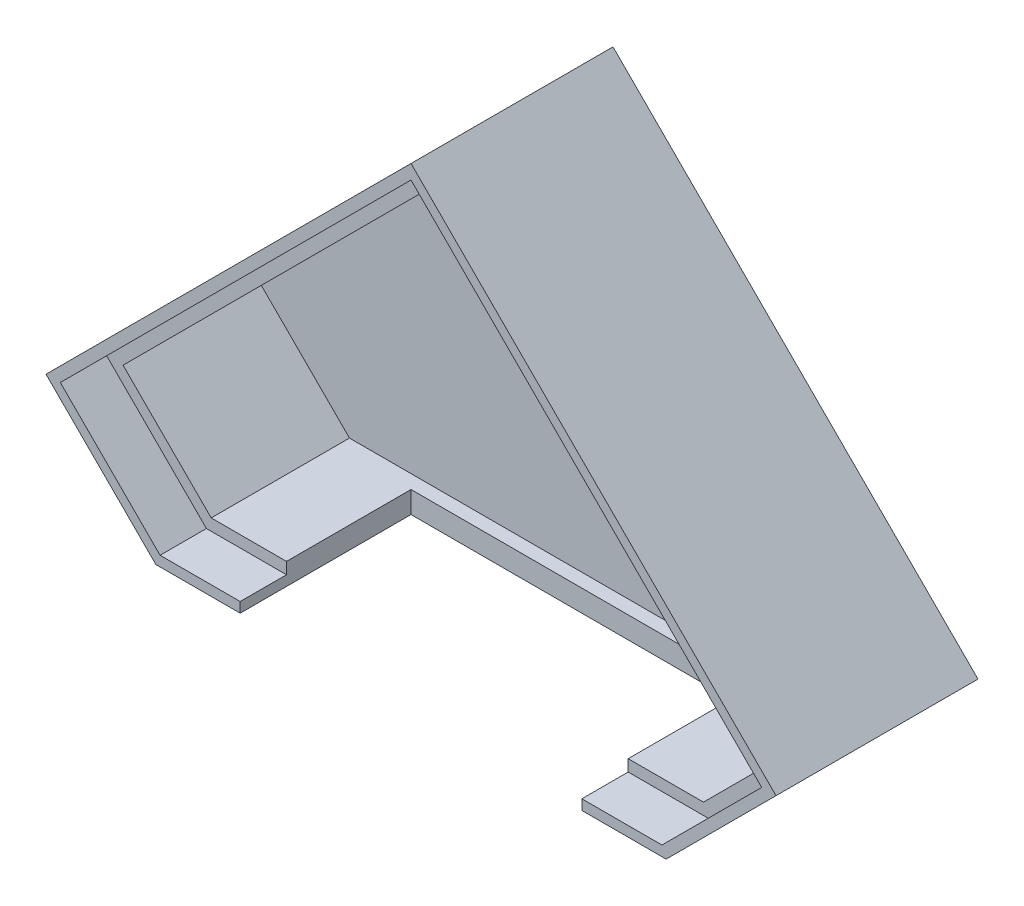
ISO-10303-21;
HEADER;
FILE_DESCRIPTION(('STEP AP214'),'2;1');
FILE_NAME('part.step','',(''),(''),'','','');
FILE_SCHEMA(('AUTOMOTIVE_DESIGN { 1 0 10303 214 1 1 1 1 }'));
ENDSEC;
DATA;
#1=APPLICATION_CONTEXT('core data for automotive mechanical design processes');
#2=APPLICATION_PROTOCOL_DEFINITION('international standard','automotive_design',2000,#1);
#3=PRODUCT_CONTEXT('',#1,'mechanical');
#4=PRODUCT('Part','Part','',(#3));
#5=PRODUCT_RELATED_PRODUCT_CATEGORY('part','',(#4));
#6=PRODUCT_DEFINITION_FORMATION('','',#4);
#7=PRODUCT_DEFINITION_CONTEXT('part definition',#1,'design');
#8=PRODUCT_DEFINITION('design','',#6,#7);
#9=PRODUCT_DEFINITION_SHAPE('','',#8);
#10=(LENGTH_UNIT() NAMED_UNIT(*) SI_UNIT(.MILLI.,.METRE.));
#11=(NAMED_UNIT(*) PLANE_ANGLE_UNIT() SI_UNIT($,.RADIAN.));
#12=(NAMED_UNIT(*) SI_UNIT($,.STERADIAN.) SOLID_ANGLE_UNIT());
#13=UNCERTAINTY_MEASURE_WITH_UNIT(LENGTH_MEASURE(1.E-05),#10,'distance_accuracy_value','');
#14=(GEOMETRIC_REPRESENTATION_CONTEXT(3) GLOBAL_UNCERTAINTY_ASSIGNED_CONTEXT((#13)) GLOBAL_UNIT_ASSIGNED_CONTEXT((#10,
#11,#12)) REPRESENTATION_CONTEXT('',''));
#15=CARTESIAN_POINT('',(0.,0.,0.));
#16=DIRECTION('',(0.,0.,1.));
#17=DIRECTION('',(1.,0.,0.));
#18=AXIS2_PLACEMENT_3D('',#15,#16,#17);
#19=CARTESIAN_POINT('',(-17.,-12.,-12.75));
#20=DIRECTION('',(0.,-1.,0.));
#21=DIRECTION('',(0.,0.,-1.));
#22=AXIS2_PLACEMENT_3D('',#19,#20,#21);
#23=PLANE('',#22);
#24=DIRECTION('',(-1.,0.,0.));
#25=VECTOR('',#24,1.);
#26=CARTESIAN_POINT('',(-17.,-12.,-3.2));
#27=LINE('',#26,#25);
#28=CARTESIAN_POINT('',(17.,-12.,-3.2));
#29=VERTEX_POINT('',#28);
#30=CARTESIAN_POINT('',(11.8,-12.,-3.2));
#31=VERTEX_POINT('',#30);
#32=EDGE_CURVE('E297',#29,#31,#27,.T.);
#33=ORIENTED_EDGE('',*,*,#32,.F.);
#34=DIRECTION('',(0.,0.,1.));
#35=VECTOR('',#34,1.);
#36=CARTESIAN_POINT('',(17.,-12.,-12.75));
#37=LINE('',#36,#35);
#38=CARTESIAN_POINT('',(17.,-12.,-12.75));
#39=VERTEX_POINT('',#38);
#40=EDGE_CURVE('E378',#39,#29,#37,.T.);
#41=ORIENTED_EDGE('',*,*,#40,.F.);
#42=DIRECTION('',(1.,0.,0.));
#43=VECTOR('',#42,1.);
#44=CARTESIAN_POINT('',(-17.,-12.,-12.75));
#45=LINE('',#44,#43);
#46=CARTESIAN_POINT('',(-17.,-12.,-12.75));
#47=VERTEX_POINT('',#46);
#48=EDGE_CURVE('E357',#47,#39,#45,.T.);
#49=ORIENTED_EDGE('',*,*,#48,.F.);
#50=DIRECTION('',(0.,0.,1.));
#51=VECTOR('',#50,1.);
#52=CARTESIAN_POINT('',(-17.,-12.,-12.75));
#53=LINE('',#52,#51);
#54=CARTESIAN_POINT('',(-17.,-12.,-3.2));
#55=VERTEX_POINT('',#54);
#56=EDGE_CURVE('E367',#47,#55,#53,.T.);
#57=ORIENTED_EDGE('',*,*,#56,.T.);
#58=CARTESIAN_POINT('',(-11.8,-12.,-3.2));
#59=VERTEX_POINT('',#58);
#60=EDGE_CURVE('E294',#59,#55,#27,.T.);
#61=ORIENTED_EDGE('',*,*,#60,.F.);
#62=DIRECTION('',(0.,0.,1.));
#63=VECTOR('',#62,1.);
#64=CARTESIAN_POINT('',(-11.8,-12.,11.8));
#65=LINE('',#64,#63);
#66=CARTESIAN_POINT('',(-11.8,-12.,-11.8));
#67=VERTEX_POINT('',#66);
#68=EDGE_CURVE('E320',#67,#59,#65,.T.);
#69=ORIENTED_EDGE('',*,*,#68,.F.);
#70=DIRECTION('',(-1.,0.,0.));
#71=VECTOR('',#70,1.);
#72=CARTESIAN_POINT('',(-11.8,-12.,-11.8));
#73=LINE('',#72,#71);
#74=CARTESIAN_POINT('',(11.8,-12.,-11.8));
#75=VERTEX_POINT('',#74);
#76=EDGE_CURVE('E323',#75,#67,#73,.T.);
#77=ORIENTED_EDGE('',*,*,#76,.F.);
#78=DIRECTION('',(0.,0.,-1.));
#79=VECTOR('',#78,1.);
#80=CARTESIAN_POINT('',(11.8,-12.,11.8));
#81=LINE('',#80,#79);
#82=EDGE_CURVE('E326',#31,#75,#81,.T.);
#83=ORIENTED_EDGE('',*,*,#82,.F.);
#84=EDGE_LOOP('',(#33,#41,#49,#57,#61,#69,#77,#83));
#85=FACE_BOUND('',#84,.T.);
#86=ADVANCED_FACE('F94',(#85),#23,.F.);
#87=CARTESIAN_POINT('',(23.09008708557,-5.90991291443007,-12.75));
#88=DIRECTION('',(0.707106781186548,0.707106781186547,0.));
#89=DIRECTION('',(-0.707106781186547,0.707106781186548,0.));
#90=AXIS2_PLACEMENT_3D('',#87,#88,#89);
#91=PLANE('',#90);
#92=DIRECTION('',(0.707106781186547,-0.707106781186548,0.));
#93=VECTOR('',#92,1.);
#94=CARTESIAN_POINT('',(23.09008708557,-5.90991291443007,-3.2));
#95=LINE('',#94,#93);
#96=CARTESIAN_POINT('',(0.,17.1801741711399,-3.2));
#97=VERTEX_POINT('',#96);
#98=CARTESIAN_POINT('',(23.09008708557,-5.90991291443007,-3.2));
#99=VERTEX_POINT('',#98);
#100=EDGE_CURVE('E292',#97,#99,#95,.T.);
#101=ORIENTED_EDGE('',*,*,#100,.F.);
#102=DIRECTION('',(0.,0.,1.));
#103=VECTOR('',#102,1.);
#104=CARTESIAN_POINT('',(0.,17.1801741711399,-12.75));
#105=LINE('',#104,#103);
#106=CARTESIAN_POINT('',(0.,17.1801741711399,-12.75));
#107=VERTEX_POINT('',#106);
#108=EDGE_CURVE('E372',#107,#97,#105,.T.);
#109=ORIENTED_EDGE('',*,*,#108,.F.);
#110=DIRECTION('',(-0.707106781186547,0.707106781186548,0.));
#111=VECTOR('',#110,1.);
#112=CARTESIAN_POINT('',(23.09008708557,-5.90991291443007,-12.75));
#113=LINE('',#112,#111);
#114=CARTESIAN_POINT('',(23.09008708557,-5.90991291443007,-12.75));
#115=VERTEX_POINT('',#114);
#116=EDGE_CURVE('E361',#115,#107,#113,.T.);
#117=ORIENTED_EDGE('',*,*,#116,.F.);
#118=DIRECTION('',(0.,0.,1.));
#119=VECTOR('',#118,1.);
#120=CARTESIAN_POINT('',(23.09008708557,-5.90991291443007,-12.75));
#121=LINE('',#120,#119);
#122=EDGE_CURVE('E375',#115,#99,#121,.T.);
#123=ORIENTED_EDGE('',*,*,#122,.T.);
#124=EDGE_LOOP('',(#101,#109,#117,#123));
#125=FACE_BOUND('',#124,.T.);
#126=ADVANCED_FACE('F456',(#125),#91,.F.);
#127=CARTESIAN_POINT('',(17.,-12.,-12.75));
#128=DIRECTION('',(0.707106781186546,-0.707106781186549,0.));
#129=DIRECTION('',(0.707106781186549,0.707106781186546,0.));
#130=AXIS2_PLACEMENT_3D('',#127,#128,#129);
#131=PLANE('',#130);
#132=DIRECTION('',(-0.707106781186549,-0.707106781186546,0.));
#133=VECTOR('',#132,1.);
#134=CARTESIAN_POINT('',(17.,-12.,-3.2));
#135=LINE('',#134,#133);
#136=EDGE_CURVE('E299',#99,#29,#135,.T.);
#137=ORIENTED_EDGE('',*,*,#136,.F.);
#138=ORIENTED_EDGE('',*,*,#122,.F.);
#139=DIRECTION('',(0.707106781186549,0.707106781186546,0.));
#140=VECTOR('',#139,1.);
#141=CARTESIAN_POINT('',(17.,-12.,-12.75));
#142=LINE('',#141,#140);
#143=EDGE_CURVE('E117',#39,#115,#142,.T.);
#144=ORIENTED_EDGE('',*,*,#143,.F.);
#145=ORIENTED_EDGE('',*,*,#40,.T.);
#146=EDGE_LOOP('',(#137,#138,#144,#145));
#147=FACE_BOUND('',#146,.T.);
#148=ADVANCED_FACE('F462',(#147),#131,.F.);
#149=CARTESIAN_POINT('',(-23.09008708557,-5.90991291443006,-12.75));
#150=DIRECTION('',(-0.707106781186547,-0.707106781186548,0.));
#151=DIRECTION('',(0.707106781186548,-0.707106781186547,0.));
#152=AXIS2_PLACEMENT_3D('',#149,#150,#151);
#153=PLANE('',#152);
#154=DIRECTION('',(-0.707106781186548,0.707106781186547,0.));
#155=VECTOR('',#154,1.);
#156=CARTESIAN_POINT('',(-23.09008708557,-5.90991291443006,-3.2));
#157=LINE('',#156,#155);
#158=CARTESIAN_POINT('',(-23.09008708557,-5.90991291443006,-3.2));
#159=VERTEX_POINT('',#158);
#160=EDGE_CURVE('E290',#55,#159,#157,.T.);
#161=ORIENTED_EDGE('',*,*,#160,.F.);
#162=ORIENTED_EDGE('',*,*,#56,.F.);
#163=DIRECTION('',(0.707106781186548,-0.707106781186547,0.));
#164=VECTOR('',#163,1.);
#165=CARTESIAN_POINT('',(-23.09008708557,-5.90991291443006,-12.75));
#166=LINE('',#165,#164);
#167=CARTESIAN_POINT('',(-23.09008708557,-5.90991291443006,-12.75));
#168=VERTEX_POINT('',#167);
#169=EDGE_CURVE('E354',#168,#47,#166,.T.);
#170=ORIENTED_EDGE('',*,*,#169,.F.);
#171=DIRECTION('',(0.,0.,1.));
#172=VECTOR('',#171,1.);
#173=CARTESIAN_POINT('',(-23.09008708557,-5.90991291443006,-12.75));
#174=LINE('',#173,#172);
#175=EDGE_CURVE('E368',#168,#159,#174,.T.);
#176=ORIENTED_EDGE('',*,*,#175,.T.);
#177=EDGE_LOOP('',(#161,#162,#170,#176));
#178=FACE_BOUND('',#177,.T.);
#179=ADVANCED_FACE('F468',(#178),#153,.F.);
#180=CARTESIAN_POINT('',(0.,17.1801741711399,-12.75));
#181=DIRECTION('',(-0.707106781186548,0.707106781186547,0.));
#182=DIRECTION('',(-0.707106781186547,-0.707106781186548,0.));
#183=AXIS2_PLACEMENT_3D('',#180,#181,#182);
#184=PLANE('',#183);
#185=DIRECTION('',(0.707106781186547,0.707106781186548,0.));
#186=VECTOR('',#185,1.);
#187=CARTESIAN_POINT('',(0.,17.1801741711399,-3.2));
#188=LINE('',#187,#186);
#189=EDGE_CURVE('E12',#159,#97,#188,.T.);
#190=ORIENTED_EDGE('',*,*,#189,.F.);
#191=ORIENTED_EDGE('',*,*,#175,.F.);
#192=DIRECTION('',(-0.707106781186547,-0.707106781186548,0.));
#193=VECTOR('',#192,1.);
#194=CARTESIAN_POINT('',(0.,17.1801741711399,-12.75));
#195=LINE('',#194,#193);
#196=EDGE_CURVE('E364',#107,#168,#195,.T.);
#197=ORIENTED_EDGE('',*,*,#196,.F.);
#198=ORIENTED_EDGE('',*,*,#108,.T.);
#199=EDGE_LOOP('',(#190,#191,#197,#198));
#200=FACE_BOUND('',#199,.T.);
#201=ADVANCED_FACE('F471',(#200),#184,.F.);
#202=CARTESIAN_POINT('',(-24.1507472573498,-6.97057308620988,-12.75));
#203=DIRECTION('',(-0.707106781186547,-0.707106781186548,0.));
#204=DIRECTION('',(0.707106781186548,-0.707106781186547,0.));
#205=AXIS2_PLACEMENT_3D('',#202,#203,#204);
#206=PLANE('',#205);
#207=DIRECTION('',(0.707106781186548,-0.707106781186547,0.));
#208=VECTOR('',#207,1.);
#209=CARTESIAN_POINT('',(-24.1507472573498,-6.97057308620988,0.));
#210=LINE('',#209,#208);
#211=CARTESIAN_POINT('',(-25.2114074291296,-5.90991291443006,0.));
#212=VERTEX_POINT('',#211);
#213=CARTESIAN_POINT('',(-17.6213203435596,-13.5,0.));
#214=VERTEX_POINT('',#213);
#215=EDGE_CURVE('E317',#212,#214,#210,.T.);
#216=ORIENTED_EDGE('',*,*,#215,.F.);
#217=DIRECTION('',(0.,0.,1.));
#218=VECTOR('',#217,1.);
#219=CARTESIAN_POINT('',(-25.2114074291296,-5.90991291443006,-12.75));
#220=LINE('',#219,#218);
#221=CARTESIAN_POINT('',(-25.2114074291296,-5.90991291443006,-13.95));
#222=VERTEX_POINT('',#221);
#223=EDGE_CURVE('E382',#222,#212,#220,.T.);
#224=ORIENTED_EDGE('',*,*,#223,.F.);
#225=DIRECTION('',(-0.707106781186548,0.707106781186547,0.));
#226=VECTOR('',#225,1.);
#227=CARTESIAN_POINT('',(-25.2114074291296,-5.90991291443006,-13.95));
#228=LINE('',#227,#226);
#229=CARTESIAN_POINT('',(-17.6213203435596,-13.5,-13.95));
#230=VERTEX_POINT('',#229);
#231=EDGE_CURVE('E348',#230,#222,#228,.T.);
#232=ORIENTED_EDGE('',*,*,#231,.F.);
#233=DIRECTION('',(0.,0.,1.));
#234=VECTOR('',#233,1.);
#235=CARTESIAN_POINT('',(-17.6213203435596,-13.5,-12.75));
#236=LINE('',#235,#234);
#237=EDGE_CURVE('E371',#230,#214,#236,.T.);
#238=ORIENTED_EDGE('',*,*,#237,.T.);
#239=EDGE_LOOP('',(#216,#224,#232,#238));
#240=FACE_BOUND('',#239,.T.);
#241=ADVANCED_FACE('F96',(#240),#206,.T.);
#242=CARTESIAN_POINT('',(-1.06066017177982,18.2408343429197,-12.75));
#243=DIRECTION('',(-0.707106781186548,0.707106781186547,0.));
#244=DIRECTION('',(-0.707106781186547,-0.707106781186548,0.));
#245=AXIS2_PLACEMENT_3D('',#242,#243,#244);
#246=PLANE('',#245);
#247=DIRECTION('',(-0.707106781186547,-0.707106781186548,0.));
#248=VECTOR('',#247,1.);
#249=CARTESIAN_POINT('',(-1.06066017177982,18.2408343429197,0.));
#250=LINE('',#249,#248);
#251=CARTESIAN_POINT('',(0.,19.3014945146996,0.));
#252=VERTEX_POINT('',#251);
#253=EDGE_CURVE('E315',#252,#212,#250,.T.);
#254=ORIENTED_EDGE('',*,*,#253,.F.);
#255=DIRECTION('',(0.,0.,1.));
#256=VECTOR('',#255,1.);
#257=CARTESIAN_POINT('',(0.,19.3014945146996,-12.75));
#258=LINE('',#257,#256);
#259=CARTESIAN_POINT('',(0.,19.3014945146996,-13.95));
#260=VERTEX_POINT('',#259);
#261=EDGE_CURVE('E385',#260,#252,#258,.T.);
#262=ORIENTED_EDGE('',*,*,#261,.F.);
#263=DIRECTION('',(0.707106781186547,0.707106781186548,0.));
#264=VECTOR('',#263,1.);
#265=CARTESIAN_POINT('',(0.,19.3014945146996,-13.95));
#266=LINE('',#265,#264);
#267=EDGE_CURVE('E351',#222,#260,#266,.T.);
#268=ORIENTED_EDGE('',*,*,#267,.F.);
#269=ORIENTED_EDGE('',*,*,#223,.T.);
#270=EDGE_LOOP('',(#254,#262,#268,#269));
#271=FACE_BOUND('',#270,.T.);
#272=ADVANCED_FACE('F424',(#271),#246,.T.);
#273=CARTESIAN_POINT('',(24.1507472573498,-4.84925274265025,-12.75));
#274=DIRECTION('',(0.707106781186548,0.707106781186547,0.));
#275=DIRECTION('',(-0.707106781186547,0.707106781186548,0.));
#276=AXIS2_PLACEMENT_3D('',#273,#274,#275);
#277=PLANE('',#276);
#278=DIRECTION('',(-0.707106781186547,0.707106781186548,0.));
#279=VECTOR('',#278,1.);
#280=CARTESIAN_POINT('',(24.1507472573498,-4.84925274265025,0.));
#281=LINE('',#280,#279);
#282=CARTESIAN_POINT('',(25.2114074291296,-5.90991291443007,0.));
#283=VERTEX_POINT('',#282);
#284=EDGE_CURVE('E313',#283,#252,#281,.T.);
#285=ORIENTED_EDGE('',*,*,#284,.F.);
#286=DIRECTION('',(0.,0.,1.));
#287=VECTOR('',#286,1.);
#288=CARTESIAN_POINT('',(25.2114074291296,-5.90991291443007,-12.75));
#289=LINE('',#288,#287);
#290=CARTESIAN_POINT('',(25.2114074291296,-5.90991291443007,-13.95));
#291=VERTEX_POINT('',#290);
#292=EDGE_CURVE('E388',#291,#283,#289,.T.);
#293=ORIENTED_EDGE('',*,*,#292,.F.);
#294=DIRECTION('',(0.707106781186547,-0.707106781186548,0.));
#295=VECTOR('',#294,1.);
#296=CARTESIAN_POINT('',(25.2114074291296,-5.90991291443007,-13.95));
#297=LINE('',#296,#295);
#298=EDGE_CURVE('E328',#260,#291,#297,.T.);
#299=ORIENTED_EDGE('',*,*,#298,.F.);
#300=ORIENTED_EDGE('',*,*,#261,.T.);
#301=EDGE_LOOP('',(#285,#293,#299,#300));
#302=FACE_BOUND('',#301,.T.);
#303=ADVANCED_FACE('F420',(#302),#277,.T.);
#304=CARTESIAN_POINT('',(18.0606601717798,-13.0606601717798,-12.75));
#305=DIRECTION('',(0.707106781186546,-0.707106781186549,0.));
#306=DIRECTION('',(0.707106781186549,0.707106781186546,0.));
#307=AXIS2_PLACEMENT_3D('',#304,#305,#306);
#308=PLANE('',#307);
#309=DIRECTION('',(0.707106781186549,0.707106781186546,0.));
#310=VECTOR('',#309,1.);
#311=CARTESIAN_POINT('',(18.0606601717798,-13.0606601717798,0.));
#312=LINE('',#311,#310);
#313=CARTESIAN_POINT('',(17.6213203435596,-13.5,0.));
#314=VERTEX_POINT('',#313);
#315=EDGE_CURVE('E311',#314,#283,#312,.T.);
#316=ORIENTED_EDGE('',*,*,#315,.F.);
#317=DIRECTION('',(0.,0.,1.));
#318=VECTOR('',#317,1.);
#319=CARTESIAN_POINT('',(17.6213203435596,-13.5,-12.75));
#320=LINE('',#319,#318);
#321=CARTESIAN_POINT('',(17.6213203435596,-13.5,-13.95));
#322=VERTEX_POINT('',#321);
#323=EDGE_CURVE('E391',#322,#314,#320,.T.);
#324=ORIENTED_EDGE('',*,*,#323,.F.);
#325=DIRECTION('',(-0.707106781186549,-0.707106781186546,0.));
#326=VECTOR('',#325,1.);
#327=CARTESIAN_POINT('',(17.6213203435596,-13.5,-13.95));
#328=LINE('',#327,#326);
#329=EDGE_CURVE('E342',#291,#322,#328,.T.);
#330=ORIENTED_EDGE('',*,*,#329,.F.);
#331=ORIENTED_EDGE('',*,*,#292,.T.);
#332=EDGE_LOOP('',(#316,#324,#330,#331));
#333=FACE_BOUND('',#332,.T.);
#334=ADVANCED_FACE('F416',(#333),#308,.T.);
#335=CARTESIAN_POINT('',(-17.,-13.5,-12.75));
#336=DIRECTION('',(0.,-1.,0.));
#337=DIRECTION('',(0.,0.,-1.));
#338=AXIS2_PLACEMENT_3D('',#335,#336,#337);
#339=PLANE('',#338);
#340=DIRECTION('',(1.,0.,0.));
#341=VECTOR('',#340,1.);
#342=CARTESIAN_POINT('',(-25.2114074291296,-13.5,0.));
#343=LINE('',#342,#341);
#344=CARTESIAN_POINT('',(-11.8,-13.5,0.));
#345=VERTEX_POINT('',#344);
#346=EDGE_CURVE('E305',#214,#345,#343,.T.);
#347=ORIENTED_EDGE('',*,*,#346,.F.);
#348=ORIENTED_EDGE('',*,*,#237,.F.);
#349=DIRECTION('',(-1.,0.,0.));
#350=VECTOR('',#349,1.);
#351=CARTESIAN_POINT('',(-17.6213203435596,-13.5,-13.95));
#352=LINE('',#351,#350);
#353=EDGE_CURVE('E345',#322,#230,#352,.T.);
#354=ORIENTED_EDGE('',*,*,#353,.F.);
#355=ORIENTED_EDGE('',*,*,#323,.T.);
#356=CARTESIAN_POINT('',(11.8,-13.5,0.));
#357=VERTEX_POINT('',#356);
#358=EDGE_CURVE('E303',#357,#314,#343,.T.);
#359=ORIENTED_EDGE('',*,*,#358,.F.);
#360=DIRECTION('',(0.,0.,1.));
#361=VECTOR('',#360,1.);
#362=CARTESIAN_POINT('',(11.8,-13.5,11.8));
#363=LINE('',#362,#361);
#364=CARTESIAN_POINT('',(11.8,-13.5,-11.8));
#365=VERTEX_POINT('',#364);
#366=EDGE_CURVE('E319',#365,#357,#363,.T.);
#367=ORIENTED_EDGE('',*,*,#366,.F.);
#368=DIRECTION('',(1.,0.,0.));
#369=VECTOR('',#368,1.);
#370=CARTESIAN_POINT('',(-11.8,-13.5,-11.8));
#371=LINE('',#370,#369);
#372=CARTESIAN_POINT('',(-11.8,-13.5,-11.8));
#373=VERTEX_POINT('',#372);
#374=EDGE_CURVE('E333',#373,#365,#371,.T.);
#375=ORIENTED_EDGE('',*,*,#374,.F.);
#376=DIRECTION('',(0.,0.,-1.));
#377=VECTOR('',#376,1.);
#378=CARTESIAN_POINT('',(-11.8,-13.5,11.8));
#379=LINE('',#378,#377);
#380=EDGE_CURVE('E331',#345,#373,#379,.T.);
#381=ORIENTED_EDGE('',*,*,#380,.F.);
#382=EDGE_LOOP('',(#347,#348,#354,#355,#359,#367,#375,#381));
#383=FACE_BOUND('',#382,.T.);
#384=ADVANCED_FACE('F410',(#383),#339,.T.);
#385=CARTESIAN_POINT('',(0.,0.,-13.95));
#386=DIRECTION('',(0.,0.,1.));
#387=DIRECTION('',(1.,0.,0.));
#388=AXIS2_PLACEMENT_3D('',#385,#386,#387);
#389=PLANE('',#388);
#390=ORIENTED_EDGE('',*,*,#298,.T.);
#391=ORIENTED_EDGE('',*,*,#329,.T.);
#392=ORIENTED_EDGE('',*,*,#353,.T.);
#393=ORIENTED_EDGE('',*,*,#231,.T.);
#394=ORIENTED_EDGE('',*,*,#267,.T.);
#395=EDGE_LOOP('',(#390,#391,#392,#393,#394));
#396=FACE_BOUND('',#395,.T.);
#397=ADVANCED_FACE('F429',(#396),#389,.F.);
#398=CARTESIAN_POINT('',(11.8,21.375440072005,11.8));
#399=DIRECTION('',(1.,0.,0.));
#400=DIRECTION('',(0.,0.,-1.));
#401=AXIS2_PLACEMENT_3D('',#398,#399,#400);
#402=PLANE('',#401);
#403=DIRECTION('',(0.,1.,0.));
#404=VECTOR('',#403,1.);
#405=CARTESIAN_POINT('',(11.8,21.375440072005,0.));
#406=LINE('',#405,#404);
#407=CARTESIAN_POINT('',(11.8,-12.8,0.));
#408=VERTEX_POINT('',#407);
#409=EDGE_CURVE('E308',#357,#408,#406,.T.);
#410=ORIENTED_EDGE('',*,*,#409,.T.);
#411=DIRECTION('',(0.,0.,-1.));
#412=VECTOR('',#411,1.);
#413=CARTESIAN_POINT('',(11.8,-12.8,11.8));
#414=LINE('',#413,#412);
#415=CARTESIAN_POINT('',(11.8,-12.8,-3.2));
#416=VERTEX_POINT('',#415);
#417=EDGE_CURVE('E287',#408,#416,#414,.T.);
#418=ORIENTED_EDGE('',*,*,#417,.T.);
#419=DIRECTION('',(0.,-1.,0.));
#420=VECTOR('',#419,1.);
#421=CARTESIAN_POINT('',(11.8,21.375440072005,-3.2));
#422=LINE('',#421,#420);
#423=EDGE_CURVE('E301',#31,#416,#422,.T.);
#424=ORIENTED_EDGE('',*,*,#423,.F.);
#425=ORIENTED_EDGE('',*,*,#82,.T.);
#426=DIRECTION('',(0.,-1.,0.));
#427=VECTOR('',#426,1.);
#428=CARTESIAN_POINT('',(11.8,21.375440072005,-11.8));
#429=LINE('',#428,#427);
#430=EDGE_CURVE('E324',#75,#365,#429,.T.);
#431=ORIENTED_EDGE('',*,*,#430,.T.);
#432=ORIENTED_EDGE('',*,*,#366,.T.);
#433=EDGE_LOOP('',(#410,#418,#424,#425,#431,#432));
#434=FACE_BOUND('',#433,.T.);
#435=ADVANCED_FACE('F403',(#434),#402,.F.);
#436=CARTESIAN_POINT('',(-11.8,21.375440072005,-11.8));
#437=DIRECTION('',(0.,0.,-1.));
#438=DIRECTION('',(-1.,0.,0.));
#439=AXIS2_PLACEMENT_3D('',#436,#437,#438);
#440=PLANE('',#439);
#441=ORIENTED_EDGE('',*,*,#76,.T.);
#442=DIRECTION('',(0.,-1.,0.));
#443=VECTOR('',#442,1.);
#444=CARTESIAN_POINT('',(-11.8,21.375440072005,-11.8));
#445=LINE('',#444,#443);
#446=EDGE_CURVE('E336',#67,#373,#445,.T.);
#447=ORIENTED_EDGE('',*,*,#446,.T.);
#448=ORIENTED_EDGE('',*,*,#374,.T.);
#449=ORIENTED_EDGE('',*,*,#430,.F.);
#450=EDGE_LOOP('',(#441,#447,#448,#449));
#451=FACE_BOUND('',#450,.T.);
#452=ADVANCED_FACE('F486',(#451),#440,.F.);
#453=CARTESIAN_POINT('',(-11.8,21.375440072005,11.8));
#454=DIRECTION('',(-1.,0.,0.));
#455=DIRECTION('',(0.,0.,1.));
#456=AXIS2_PLACEMENT_3D('',#453,#454,#455);
#457=PLANE('',#456);
#458=DIRECTION('',(0.,1.,0.));
#459=VECTOR('',#458,1.);
#460=CARTESIAN_POINT('',(-11.8,21.375440072005,-3.2));
#461=LINE('',#460,#459);
#462=CARTESIAN_POINT('',(-11.8,-12.8,-3.2));
#463=VERTEX_POINT('',#462);
#464=EDGE_CURVE('E296',#463,#59,#461,.T.);
#465=ORIENTED_EDGE('',*,*,#464,.F.);
#466=DIRECTION('',(0.,0.,1.));
#467=VECTOR('',#466,1.);
#468=CARTESIAN_POINT('',(-11.8,-12.8,11.8));
#469=LINE('',#468,#467);
#470=CARTESIAN_POINT('',(-11.8,-12.8,0.));
#471=VERTEX_POINT('',#470);
#472=EDGE_CURVE('E278',#463,#471,#469,.T.);
#473=ORIENTED_EDGE('',*,*,#472,.T.);
#474=DIRECTION('',(0.,-1.,0.));
#475=VECTOR('',#474,1.);
#476=CARTESIAN_POINT('',(-11.8,21.375440072005,0.));
#477=LINE('',#476,#475);
#478=EDGE_CURVE('E306',#471,#345,#477,.T.);
#479=ORIENTED_EDGE('',*,*,#478,.T.);
#480=ORIENTED_EDGE('',*,*,#380,.T.);
#481=ORIENTED_EDGE('',*,*,#446,.F.);
#482=ORIENTED_EDGE('',*,*,#68,.T.);
#483=EDGE_LOOP('',(#465,#473,#479,#480,#481,#482));
#484=FACE_BOUND('',#483,.T.);
#485=ADVANCED_FACE('F436',(#484),#457,.F.);
#486=CARTESIAN_POINT('',(0.,0.,-12.75));
#487=DIRECTION('',(0.,0.,1.));
#488=DIRECTION('',(1.,0.,0.));
#489=AXIS2_PLACEMENT_3D('',#486,#487,#488);
#490=PLANE('',#489);
#491=ORIENTED_EDGE('',*,*,#116,.T.);
#492=ORIENTED_EDGE('',*,*,#196,.T.);
#493=ORIENTED_EDGE('',*,*,#169,.T.);
#494=ORIENTED_EDGE('',*,*,#48,.T.);
#495=ORIENTED_EDGE('',*,*,#143,.T.);
#496=EDGE_LOOP('',(#491,#492,#493,#494,#495));
#497=FACE_BOUND('',#496,.T.);
#498=ADVANCED_FACE('F490',(#497),#490,.T.);
#499=CARTESIAN_POINT('',(-25.2114074291296,19.3014945146996,0.));
#500=DIRECTION('',(0.,0.,-1.));
#501=DIRECTION('',(0.,1.,0.));
#502=AXIS2_PLACEMENT_3D('',#499,#500,#501);
#503=PLANE('',#502);
#504=DIRECTION('',(0.707106781186549,0.707106781186546,0.));
#505=VECTOR('',#504,1.);
#506=CARTESIAN_POINT('',(17.3313708498985,-12.8,0.));
#507=LINE('',#506,#505);
#508=CARTESIAN_POINT('',(17.3313708498985,-12.8,0.));
#509=VERTEX_POINT('',#508);
#510=CARTESIAN_POINT('',(24.2214579354684,-5.90991291443007,0.));
#511=VERTEX_POINT('',#510);
#512=EDGE_CURVE('E257',#509,#511,#507,.T.);
#513=ORIENTED_EDGE('',*,*,#512,.F.);
#514=DIRECTION('',(-1.,0.,0.));
#515=VECTOR('',#514,1.);
#516=CARTESIAN_POINT('',(-25.2114074291296,-12.8,0.));
#517=LINE('',#516,#515);
#518=EDGE_CURVE('E102',#509,#408,#517,.T.);
#519=ORIENTED_EDGE('',*,*,#518,.T.);
#520=ORIENTED_EDGE('',*,*,#409,.F.);
#521=ORIENTED_EDGE('',*,*,#358,.T.);
#522=ORIENTED_EDGE('',*,*,#315,.T.);
#523=ORIENTED_EDGE('',*,*,#284,.T.);
#524=ORIENTED_EDGE('',*,*,#253,.T.);
#525=ORIENTED_EDGE('',*,*,#215,.T.);
#526=ORIENTED_EDGE('',*,*,#346,.T.);
#527=ORIENTED_EDGE('',*,*,#478,.F.);
#528=DIRECTION('',(1.,0.,0.));
#529=VECTOR('',#528,1.);
#530=CARTESIAN_POINT('',(-17.3313708498985,-12.8,0.));
#531=LINE('',#530,#529);
#532=CARTESIAN_POINT('',(-17.3313708498985,-12.8,0.));
#533=VERTEX_POINT('',#532);
#534=EDGE_CURVE('E260',#533,#471,#531,.T.);
#535=ORIENTED_EDGE('',*,*,#534,.F.);
#536=DIRECTION('',(0.707106781186548,-0.707106781186547,0.));
#537=VECTOR('',#536,1.);
#538=CARTESIAN_POINT('',(-24.2214579354684,-5.90991291443006,0.));
#539=LINE('',#538,#537);
#540=CARTESIAN_POINT('',(-24.2214579354684,-5.90991291443006,0.));
#541=VERTEX_POINT('',#540);
#542=EDGE_CURVE('E272',#541,#533,#539,.T.);
#543=ORIENTED_EDGE('',*,*,#542,.F.);
#544=DIRECTION('',(-0.707106781186547,-0.707106781186548,0.));
#545=VECTOR('',#544,1.);
#546=CARTESIAN_POINT('',(0.,18.3115450210384,0.));
#547=LINE('',#546,#545);
#548=CARTESIAN_POINT('',(0.,18.3115450210384,0.));
#549=VERTEX_POINT('',#548);
#550=EDGE_CURVE('E270',#549,#541,#547,.T.);
#551=ORIENTED_EDGE('',*,*,#550,.F.);
#552=DIRECTION('',(-0.707106781186547,0.707106781186548,0.));
#553=VECTOR('',#552,1.);
#554=CARTESIAN_POINT('',(24.2214579354684,-5.90991291443007,0.));
#555=LINE('',#554,#553);
#556=EDGE_CURVE('E109',#511,#549,#555,.T.);
#557=ORIENTED_EDGE('',*,*,#556,.F.);
#558=EDGE_LOOP('',(#513,#519,#520,#521,#522,#523,#524,#525,#526,#527,#535,#543,#551,#557));
#559=FACE_BOUND('',#558,.T.);
#560=ADVANCED_FACE('F398',(#559),#503,.F.);
#561=CARTESIAN_POINT('',(0.,0.,-3.2));
#562=DIRECTION('',(0.,0.,1.));
#563=DIRECTION('',(1.,0.,0.));
#564=AXIS2_PLACEMENT_3D('',#561,#562,#563);
#565=PLANE('',#564);
#566=ORIENTED_EDGE('',*,*,#423,.T.);
#567=DIRECTION('',(1.,0.,0.));
#568=VECTOR('',#567,1.);
#569=CARTESIAN_POINT('',(-17.3313708498985,-12.8,-3.2));
#570=LINE('',#569,#568);
#571=CARTESIAN_POINT('',(17.3313708498985,-12.8,-3.2));
#572=VERTEX_POINT('',#571);
#573=EDGE_CURVE('E264',#416,#572,#570,.T.);
#574=ORIENTED_EDGE('',*,*,#573,.T.);
#575=DIRECTION('',(0.707106781186549,0.707106781186546,0.));
#576=VECTOR('',#575,1.);
#577=CARTESIAN_POINT('',(17.3313708498985,-12.8,-3.2));
#578=LINE('',#577,#576);
#579=CARTESIAN_POINT('',(24.2214579354684,-5.90991291443007,-3.2));
#580=VERTEX_POINT('',#579);
#581=EDGE_CURVE('E245',#572,#580,#578,.T.);
#582=ORIENTED_EDGE('',*,*,#581,.T.);
#583=DIRECTION('',(-0.707106781186547,0.707106781186548,0.));
#584=VECTOR('',#583,1.);
#585=CARTESIAN_POINT('',(24.2214579354684,-5.90991291443007,-3.2));
#586=LINE('',#585,#584);
#587=CARTESIAN_POINT('',(0.,18.3115450210384,-3.2));
#588=VERTEX_POINT('',#587);
#589=EDGE_CURVE('E239',#580,#588,#586,.T.);
#590=ORIENTED_EDGE('',*,*,#589,.T.);
#591=DIRECTION('',(-0.707106781186547,-0.707106781186548,0.));
#592=VECTOR('',#591,1.);
#593=CARTESIAN_POINT('',(0.,18.3115450210384,-3.2));
#594=LINE('',#593,#592);
#595=CARTESIAN_POINT('',(-24.2214579354684,-5.90991291443006,-3.2));
#596=VERTEX_POINT('',#595);
#597=EDGE_CURVE('E248',#588,#596,#594,.T.);
#598=ORIENTED_EDGE('',*,*,#597,.T.);
#599=DIRECTION('',(0.707106781186548,-0.707106781186547,0.));
#600=VECTOR('',#599,1.);
#601=CARTESIAN_POINT('',(-24.2214579354684,-5.90991291443006,-3.2));
#602=LINE('',#601,#600);
#603=CARTESIAN_POINT('',(-17.3313708498985,-12.8,-3.2));
#604=VERTEX_POINT('',#603);
#605=EDGE_CURVE('E253',#596,#604,#602,.T.);
#606=ORIENTED_EDGE('',*,*,#605,.T.);
#607=EDGE_CURVE('E265',#604,#463,#570,.T.);
#608=ORIENTED_EDGE('',*,*,#607,.T.);
#609=ORIENTED_EDGE('',*,*,#464,.T.);
#610=ORIENTED_EDGE('',*,*,#60,.T.);
#611=ORIENTED_EDGE('',*,*,#160,.T.);
#612=ORIENTED_EDGE('',*,*,#189,.T.);
#613=ORIENTED_EDGE('',*,*,#100,.T.);
#614=ORIENTED_EDGE('',*,*,#136,.T.);
#615=ORIENTED_EDGE('',*,*,#32,.T.);
#616=EDGE_LOOP('',(#566,#574,#582,#590,#598,#606,#608,#609,#610,#611,#612,#613,#614,#615));
#617=FACE_BOUND('',#616,.T.);
#618=ADVANCED_FACE('F255',(#617),#565,.T.);
#619=CARTESIAN_POINT('',(-17.3313708498985,-12.8,-3.2));
#620=DIRECTION('',(0.,-1.,0.));
#621=DIRECTION('',(0.,0.,-1.));
#622=AXIS2_PLACEMENT_3D('',#619,#620,#621);
#623=PLANE('',#622);
#624=ORIENTED_EDGE('',*,*,#518,.F.);
#625=DIRECTION('',(0.,0.,1.));
#626=VECTOR('',#625,1.);
#627=CARTESIAN_POINT('',(17.3313708498985,-12.8,-3.2));
#628=LINE('',#627,#626);
#629=EDGE_CURVE('E279',#572,#509,#628,.T.);
#630=ORIENTED_EDGE('',*,*,#629,.F.);
#631=ORIENTED_EDGE('',*,*,#573,.F.);
#632=ORIENTED_EDGE('',*,*,#417,.F.);
#633=EDGE_LOOP('',(#624,#630,#631,#632));
#634=FACE_BOUND('',#633,.T.);
#635=ADVANCED_FACE('F524',(#634),#623,.F.);
#636=ORIENTED_EDGE('',*,*,#607,.F.);
#637=DIRECTION('',(0.,0.,1.));
#638=VECTOR('',#637,1.);
#639=CARTESIAN_POINT('',(-17.3313708498985,-12.8,-3.2));
#640=LINE('',#639,#638);
#641=EDGE_CURVE('E282',#604,#533,#640,.T.);
#642=ORIENTED_EDGE('',*,*,#641,.T.);
#643=ORIENTED_EDGE('',*,*,#534,.T.);
#644=ORIENTED_EDGE('',*,*,#472,.F.);
#645=EDGE_LOOP('',(#636,#642,#643,#644));
#646=FACE_BOUND('',#645,.T.);
#647=ADVANCED_FACE('F440',(#646),#623,.F.);
#648=CARTESIAN_POINT('',(24.2214579354684,-5.90991291443007,-3.2));
#649=DIRECTION('',(0.707106781186548,0.707106781186547,0.));
#650=DIRECTION('',(-0.707106781186547,0.707106781186548,0.));
#651=AXIS2_PLACEMENT_3D('',#648,#649,#650);
#652=PLANE('',#651);
#653=ORIENTED_EDGE('',*,*,#556,.T.);
#654=DIRECTION('',(0.,0.,1.));
#655=VECTOR('',#654,1.);
#656=CARTESIAN_POINT('',(0.,18.3115450210384,-3.2));
#657=LINE('',#656,#655);
#658=EDGE_CURVE('E235',#588,#549,#657,.T.);
#659=ORIENTED_EDGE('',*,*,#658,.F.);
#660=ORIENTED_EDGE('',*,*,#589,.F.);
#661=DIRECTION('',(0.,0.,1.));
#662=VECTOR('',#661,1.);
#663=CARTESIAN_POINT('',(24.2214579354684,-5.90991291443007,-3.2));
#664=LINE('',#663,#662);
#665=EDGE_CURVE('E276',#580,#511,#664,.T.);
#666=ORIENTED_EDGE('',*,*,#665,.T.);
#667=EDGE_LOOP('',(#653,#659,#660,#666));
#668=FACE_BOUND('',#667,.T.);
#669=ADVANCED_FACE('F237',(#668),#652,.F.);
#670=CARTESIAN_POINT('',(17.3313708498985,-12.8,-3.2));
#671=DIRECTION('',(0.707106781186546,-0.707106781186549,0.));
#672=DIRECTION('',(0.707106781186549,0.707106781186546,0.));
#673=AXIS2_PLACEMENT_3D('',#670,#671,#672);
#674=PLANE('',#673);
#675=ORIENTED_EDGE('',*,*,#512,.T.);
#676=ORIENTED_EDGE('',*,*,#665,.F.);
#677=ORIENTED_EDGE('',*,*,#581,.F.);
#678=ORIENTED_EDGE('',*,*,#629,.T.);
#679=EDGE_LOOP('',(#675,#676,#677,#678));
#680=FACE_BOUND('',#679,.T.);
#681=ADVANCED_FACE('F445',(#680),#674,.F.);
#682=CARTESIAN_POINT('',(-24.2214579354684,-5.90991291443006,-3.2));
#683=DIRECTION('',(-0.707106781186547,-0.707106781186548,0.));
#684=DIRECTION('',(0.707106781186548,-0.707106781186547,0.));
#685=AXIS2_PLACEMENT_3D('',#682,#683,#684);
#686=PLANE('',#685);
#687=ORIENTED_EDGE('',*,*,#542,.T.);
#688=ORIENTED_EDGE('',*,*,#641,.F.);
#689=ORIENTED_EDGE('',*,*,#605,.F.);
#690=DIRECTION('',(0.,0.,1.));
#691=VECTOR('',#690,1.);
#692=CARTESIAN_POINT('',(-24.2214579354684,-5.90991291443006,-3.2));
#693=LINE('',#692,#691);
#694=EDGE_CURVE('E244',#596,#541,#693,.T.);
#695=ORIENTED_EDGE('',*,*,#694,.T.);
#696=EDGE_LOOP('',(#687,#688,#689,#695));
#697=FACE_BOUND('',#696,.T.);
#698=ADVANCED_FACE('F443',(#697),#686,.F.);
#699=CARTESIAN_POINT('',(0.,18.3115450210384,-3.2));
#700=DIRECTION('',(-0.707106781186548,0.707106781186547,0.));
#701=DIRECTION('',(-0.707106781186547,-0.707106781186548,0.));
#702=AXIS2_PLACEMENT_3D('',#699,#700,#701);
#703=PLANE('',#702);
#704=ORIENTED_EDGE('',*,*,#550,.T.);
#705=ORIENTED_EDGE('',*,*,#694,.F.);
#706=ORIENTED_EDGE('',*,*,#597,.F.);
#707=ORIENTED_EDGE('',*,*,#658,.T.);
#708=EDGE_LOOP('',(#704,#705,#706,#707));
#709=FACE_BOUND('',#708,.T.);
#710=ADVANCED_FACE('F249',(#709),#703,.F.);
#711=CLOSED_SHELL('',(#86,#126,#148,#179,#201,#241,#272,#303,#334,#384,#397,#435,#452,#485,#498,
#560,#618,#635,#647,#669,#681,#698,#710));
#712=MANIFOLD_SOLID_BREP('B2',#711);
#713=ADVANCED_BREP_SHAPE_REPRESENTATION('',(#18,#712),#14);
#714=SHAPE_DEFINITION_REPRESENTATION(#9,#713);
ENDSEC;
END-ISO-10303-21;
